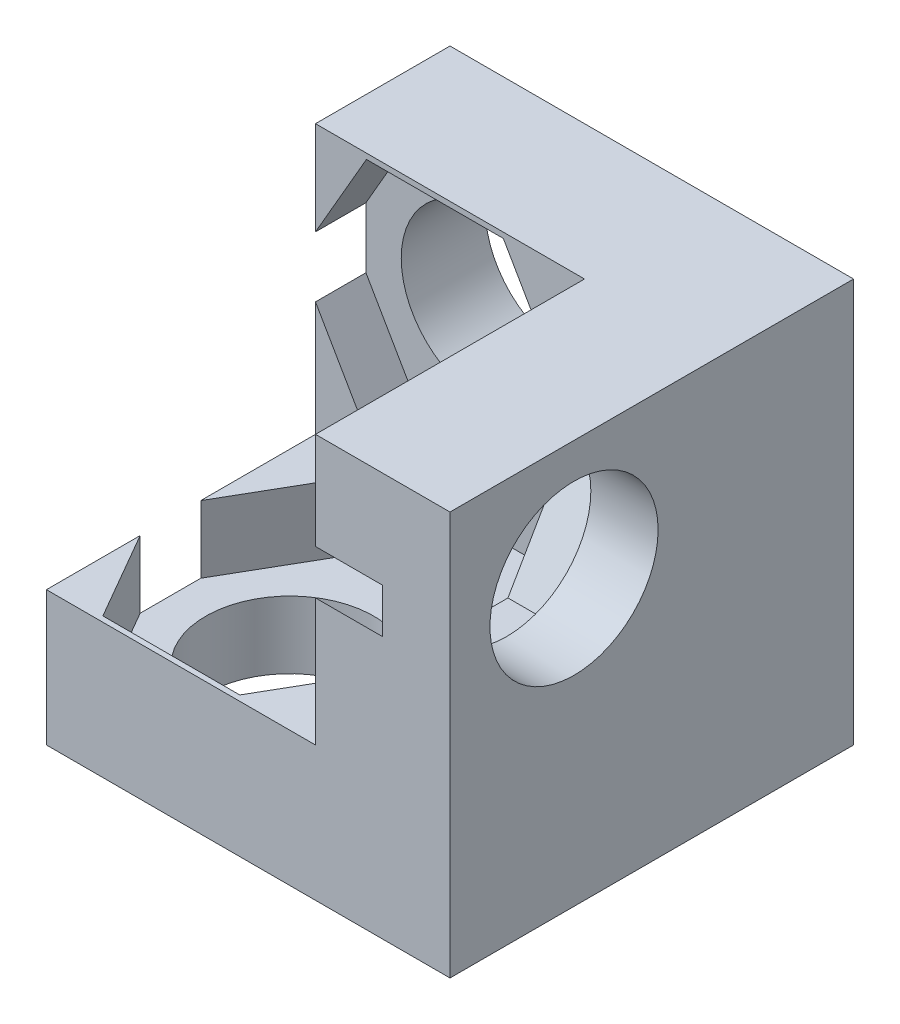
ISO-10303-21;
HEADER;
FILE_DESCRIPTION(('STEP AP214'),'2;1');
FILE_NAME('part.step','',(''),(''),'','','');
FILE_SCHEMA(('AUTOMOTIVE_DESIGN { 1 0 10303 214 1 1 1 1 }'));
ENDSEC;
DATA;
#1=APPLICATION_CONTEXT('core data for automotive mechanical design processes');
#2=APPLICATION_PROTOCOL_DEFINITION('international standard','automotive_design',2000,#1);
#3=PRODUCT_CONTEXT('',#1,'mechanical');
#4=PRODUCT('Part','Part','',(#3));
#5=PRODUCT_RELATED_PRODUCT_CATEGORY('part','',(#4));
#6=PRODUCT_DEFINITION_FORMATION('','',#4);
#7=PRODUCT_DEFINITION_CONTEXT('part definition',#1,'design');
#8=PRODUCT_DEFINITION('design','',#6,#7);
#9=PRODUCT_DEFINITION_SHAPE('','',#8);
#10=(LENGTH_UNIT() NAMED_UNIT(*) SI_UNIT(.MILLI.,.METRE.));
#11=(NAMED_UNIT(*) PLANE_ANGLE_UNIT() SI_UNIT($,.RADIAN.));
#12=(NAMED_UNIT(*) SI_UNIT($,.STERADIAN.) SOLID_ANGLE_UNIT());
#13=UNCERTAINTY_MEASURE_WITH_UNIT(LENGTH_MEASURE(1.E-05),#10,'distance_accuracy_value','');
#14=(GEOMETRIC_REPRESENTATION_CONTEXT(3) GLOBAL_UNCERTAINTY_ASSIGNED_CONTEXT((#13)) GLOBAL_UNIT_ASSIGNED_CONTEXT((#10,
#11,#12)) REPRESENTATION_CONTEXT('',''));
#15=CARTESIAN_POINT('',(0.,0.,0.));
#16=DIRECTION('',(0.,0.,1.));
#17=DIRECTION('',(1.,0.,0.));
#18=AXIS2_PLACEMENT_3D('',#15,#16,#17);
#19=CARTESIAN_POINT('',(-6.,2.44974747,8.31217259));
#20=DIRECTION('',(1.,0.,0.));
#21=DIRECTION('',(0.,0.,-1.));
#22=AXIS2_PLACEMENT_3D('',#19,#20,#21);
#23=CYLINDRICAL_SURFACE('',#22,2.5);
#24=CARTESIAN_POINT('',(6.,2.44974747,8.31217259));
#25=DIRECTION('',(1.,0.,0.));
#26=DIRECTION('',(0.,0.,-1.));
#27=AXIS2_PLACEMENT_3D('',#24,#25,#26);
#28=CIRCLE('',#27,2.5);
#29=CARTESIAN_POINT('',(6.,2.44974747,5.81217259));
#30=VERTEX_POINT('',#29);
#31=EDGE_CURVE('E421',#30,#30,#28,.T.);
#32=ORIENTED_EDGE('',*,*,#31,.T.);
#33=EDGE_LOOP('',(#32));
#34=FACE_BOUND('',#33,.T.);
#35=CARTESIAN_POINT('',(4.,2.44974747,8.31217259));
#36=DIRECTION('',(-1.,0.,0.));
#37=DIRECTION('',(0.,0.,1.));
#38=AXIS2_PLACEMENT_3D('',#35,#36,#37);
#39=CIRCLE('',#38,2.5);
#40=CARTESIAN_POINT('',(4.,2.44974747,10.81217259));
#41=VERTEX_POINT('',#40);
#42=EDGE_CURVE('E291',#41,#41,#39,.F.);
#43=ORIENTED_EDGE('',*,*,#42,.F.);
#44=EDGE_LOOP('',(#43));
#45=FACE_BOUND('',#44,.T.);
#46=ADVANCED_FACE('F46',(#34,#45),#23,.F.);
#47=CARTESIAN_POINT('',(-2.44974747,-6.,8.31217259));
#48=DIRECTION('',(0.,1.,0.));
#49=DIRECTION('',(0.,0.,1.));
#50=AXIS2_PLACEMENT_3D('',#47,#48,#49);
#51=CYLINDRICAL_SURFACE('',#50,2.5);
#52=CARTESIAN_POINT('',(-2.44974747,-6.,8.31217259));
#53=DIRECTION('',(0.,1.,0.));
#54=DIRECTION('',(0.,0.,1.));
#55=AXIS2_PLACEMENT_3D('',#52,#53,#54);
#56=CIRCLE('',#55,2.5);
#57=CARTESIAN_POINT('',(-2.44974747,-6.,10.81217259));
#58=VERTEX_POINT('',#57);
#59=EDGE_CURVE('E430',#58,#58,#56,.T.);
#60=ORIENTED_EDGE('',*,*,#59,.F.);
#61=EDGE_LOOP('',(#60));
#62=FACE_BOUND('',#61,.T.);
#63=CARTESIAN_POINT('',(-2.44974747,-4.,8.31217259));
#64=DIRECTION('',(0.,1.,0.));
#65=DIRECTION('',(0.,0.,1.));
#66=AXIS2_PLACEMENT_3D('',#63,#64,#65);
#67=CIRCLE('',#66,2.5);
#68=CARTESIAN_POINT('',(-2.44974747,-4.,10.81217259));
#69=VERTEX_POINT('',#68);
#70=EDGE_CURVE('E352',#69,#69,#67,.F.);
#71=ORIENTED_EDGE('',*,*,#70,.F.);
#72=EDGE_LOOP('',(#71));
#73=FACE_BOUND('',#72,.T.);
#74=ADVANCED_FACE('F626',(#62,#73),#51,.F.);
#75=CARTESIAN_POINT('',(0.,6.,12.));
#76=DIRECTION('',(0.,1.,0.));
#77=DIRECTION('',(0.,0.,1.));
#78=AXIS2_PLACEMENT_3D('',#75,#76,#77);
#79=PLANE('',#78);
#80=DIRECTION('',(1.,0.,0.));
#81=VECTOR('',#80,1.);
#82=CARTESIAN_POINT('',(0.,6.,4.));
#83=LINE('',#82,#81);
#84=CARTESIAN_POINT('',(-6.,6.,4.));
#85=VERTEX_POINT('',#84);
#86=CARTESIAN_POINT('',(2.,6.,4.));
#87=VERTEX_POINT('',#86);
#88=EDGE_CURVE('E440',#85,#87,#83,.T.);
#89=ORIENTED_EDGE('',*,*,#88,.T.);
#90=DIRECTION('',(0.,0.,1.));
#91=VECTOR('',#90,1.);
#92=CARTESIAN_POINT('',(2.,6.,0.));
#93=LINE('',#92,#91);
#94=CARTESIAN_POINT('',(2.,6.,12.));
#95=VERTEX_POINT('',#94);
#96=EDGE_CURVE('E431',#87,#95,#93,.T.);
#97=ORIENTED_EDGE('',*,*,#96,.T.);
#98=DIRECTION('',(1.,0.,0.));
#99=VECTOR('',#98,1.);
#100=CARTESIAN_POINT('',(0.,6.,12.));
#101=LINE('',#100,#99);
#102=CARTESIAN_POINT('',(6.,6.,12.));
#103=VERTEX_POINT('',#102);
#104=EDGE_CURVE('E480',#95,#103,#101,.T.);
#105=ORIENTED_EDGE('',*,*,#104,.T.);
#106=DIRECTION('',(0.,0.,-1.));
#107=VECTOR('',#106,1.);
#108=CARTESIAN_POINT('',(6.,6.,12.));
#109=LINE('',#108,#107);
#110=CARTESIAN_POINT('',(6.,6.,0.));
#111=VERTEX_POINT('',#110);
#112=EDGE_CURVE('E503',#103,#111,#109,.T.);
#113=ORIENTED_EDGE('',*,*,#112,.T.);
#114=DIRECTION('',(1.,0.,0.));
#115=VECTOR('',#114,1.);
#116=CARTESIAN_POINT('',(0.,6.,0.));
#117=LINE('',#116,#115);
#118=CARTESIAN_POINT('',(-6.,6.,0.));
#119=VERTEX_POINT('',#118);
#120=EDGE_CURVE('E493',#119,#111,#117,.T.);
#121=ORIENTED_EDGE('',*,*,#120,.F.);
#122=DIRECTION('',(0.,0.,-1.));
#123=VECTOR('',#122,1.);
#124=CARTESIAN_POINT('',(-6.,6.,12.));
#125=LINE('',#124,#123);
#126=EDGE_CURVE('E499',#85,#119,#125,.T.);
#127=ORIENTED_EDGE('',*,*,#126,.F.);
#128=EDGE_LOOP('',(#89,#97,#105,#113,#121,#127));
#129=FACE_BOUND('',#128,.T.);
#130=ADVANCED_FACE('F585',(#129),#79,.T.);
#131=CARTESIAN_POINT('',(0.,-6.,12.));
#132=DIRECTION('',(0.,1.,0.));
#133=DIRECTION('',(0.,0.,1.));
#134=AXIS2_PLACEMENT_3D('',#131,#132,#133);
#135=PLANE('',#134);
#136=ORIENTED_EDGE('',*,*,#59,.T.);
#137=EDGE_LOOP('',(#136));
#138=FACE_BOUND('',#137,.T.);
#139=DIRECTION('',(1.,0.,0.));
#140=VECTOR('',#139,1.);
#141=CARTESIAN_POINT('',(0.,-6.,0.));
#142=LINE('',#141,#140);
#143=CARTESIAN_POINT('',(-6.,-6.,0.));
#144=VERTEX_POINT('',#143);
#145=CARTESIAN_POINT('',(6.,-6.,0.));
#146=VERTEX_POINT('',#145);
#147=EDGE_CURVE('E457',#144,#146,#142,.T.);
#148=ORIENTED_EDGE('',*,*,#147,.T.);
#149=DIRECTION('',(0.,0.,-1.));
#150=VECTOR('',#149,1.);
#151=CARTESIAN_POINT('',(6.,-6.,12.));
#152=LINE('',#151,#150);
#153=CARTESIAN_POINT('',(6.,-6.,12.));
#154=VERTEX_POINT('',#153);
#155=EDGE_CURVE('E506',#154,#146,#152,.T.);
#156=ORIENTED_EDGE('',*,*,#155,.F.);
#157=DIRECTION('',(1.,0.,0.));
#158=VECTOR('',#157,1.);
#159=CARTESIAN_POINT('',(0.,-6.,12.));
#160=LINE('',#159,#158);
#161=CARTESIAN_POINT('',(-6.,-6.,12.));
#162=VERTEX_POINT('',#161);
#163=EDGE_CURVE('E466',#162,#154,#160,.T.);
#164=ORIENTED_EDGE('',*,*,#163,.F.);
#165=DIRECTION('',(0.,0.,-1.));
#166=VECTOR('',#165,1.);
#167=CARTESIAN_POINT('',(-6.,-6.,12.));
#168=LINE('',#167,#166);
#169=EDGE_CURVE('E485',#162,#144,#168,.T.);
#170=ORIENTED_EDGE('',*,*,#169,.T.);
#171=EDGE_LOOP('',(#148,#156,#164,#170));
#172=FACE_BOUND('',#171,.T.);
#173=ADVANCED_FACE('F48',(#138,#172),#135,.F.);
#174=CARTESIAN_POINT('',(6.,0.,12.));
#175=DIRECTION('',(-1.,0.,0.));
#176=DIRECTION('',(0.,0.,1.));
#177=AXIS2_PLACEMENT_3D('',#174,#175,#176);
#178=PLANE('',#177);
#179=ORIENTED_EDGE('',*,*,#31,.F.);
#180=EDGE_LOOP('',(#179));
#181=FACE_BOUND('',#180,.T.);
#182=DIRECTION('',(0.,1.,0.));
#183=VECTOR('',#182,1.);
#184=CARTESIAN_POINT('',(6.,0.,0.));
#185=LINE('',#184,#183);
#186=EDGE_CURVE('E487',#146,#111,#185,.T.);
#187=ORIENTED_EDGE('',*,*,#186,.T.);
#188=ORIENTED_EDGE('',*,*,#112,.F.);
#189=DIRECTION('',(0.,1.,0.));
#190=VECTOR('',#189,1.);
#191=CARTESIAN_POINT('',(6.,0.,12.));
#192=LINE('',#191,#190);
#193=EDGE_CURVE('E475',#154,#103,#192,.T.);
#194=ORIENTED_EDGE('',*,*,#193,.F.);
#195=ORIENTED_EDGE('',*,*,#155,.T.);
#196=EDGE_LOOP('',(#187,#188,#194,#195));
#197=FACE_BOUND('',#196,.T.);
#198=ADVANCED_FACE('F576',(#181,#197),#178,.F.);
#199=CARTESIAN_POINT('',(-6.,0.,12.));
#200=DIRECTION('',(1.,0.,0.));
#201=DIRECTION('',(0.,0.,-1.));
#202=AXIS2_PLACEMENT_3D('',#199,#200,#201);
#203=PLANE('',#202);
#204=DIRECTION('',(0.,0.,1.));
#205=VECTOR('',#204,1.);
#206=CARTESIAN_POINT('',(-6.,-2.,0.));
#207=LINE('',#206,#205);
#208=CARTESIAN_POINT('',(-6.,-2.,9.21295482834005));
#209=VERTEX_POINT('',#208);
#210=CARTESIAN_POINT('',(-6.,-2.,12.));
#211=VERTEX_POINT('',#210);
#212=EDGE_CURVE('E439',#209,#211,#207,.T.);
#213=ORIENTED_EDGE('',*,*,#212,.F.);
#214=DIRECTION('',(0.,-1.,0.));
#215=VECTOR('',#214,1.);
#216=CARTESIAN_POINT('',(-6.,0.,9.21295482834005));
#217=LINE('',#216,#215);
#218=CARTESIAN_POINT('',(-6.,-4.,9.21295482834005));
#219=VERTEX_POINT('',#218);
#220=EDGE_CURVE('E538',#209,#219,#217,.T.);
#221=ORIENTED_EDGE('',*,*,#220,.T.);
#222=DIRECTION('',(0.,0.,1.));
#223=VECTOR('',#222,1.);
#224=CARTESIAN_POINT('',(-6.,-4.,12.));
#225=LINE('',#224,#223);
#226=CARTESIAN_POINT('',(-6.,-4.,7.41139035165995));
#227=VERTEX_POINT('',#226);
#228=EDGE_CURVE('E364',#227,#219,#225,.T.);
#229=ORIENTED_EDGE('',*,*,#228,.F.);
#230=DIRECTION('',(0.,1.,0.));
#231=VECTOR('',#230,1.);
#232=CARTESIAN_POINT('',(-6.,0.,7.41139035165995));
#233=LINE('',#232,#231);
#234=CARTESIAN_POINT('',(-6.,-2.,7.41139035165995));
#235=VERTEX_POINT('',#234);
#236=EDGE_CURVE('E535',#227,#235,#233,.T.);
#237=ORIENTED_EDGE('',*,*,#236,.T.);
#238=CARTESIAN_POINT('',(-6.,-2.,4.));
#239=VERTEX_POINT('',#238);
#240=EDGE_CURVE('E441',#239,#235,#207,.T.);
#241=ORIENTED_EDGE('',*,*,#240,.F.);
#242=DIRECTION('',(0.,1.,0.));
#243=VECTOR('',#242,1.);
#244=CARTESIAN_POINT('',(-6.,-2.,4.));
#245=LINE('',#244,#243);
#246=CARTESIAN_POINT('',(-6.,1.41139035165995,4.));
#247=VERTEX_POINT('',#246);
#248=EDGE_CURVE('E462',#239,#247,#245,.T.);
#249=ORIENTED_EDGE('',*,*,#248,.T.);
#250=DIRECTION('',(0.,0.,-1.));
#251=VECTOR('',#250,1.);
#252=CARTESIAN_POINT('',(-6.,1.41139035165995,12.));
#253=LINE('',#252,#251);
#254=CARTESIAN_POINT('',(-6.,1.41139035165995,2.5));
#255=VERTEX_POINT('',#254);
#256=EDGE_CURVE('E414',#247,#255,#253,.T.);
#257=ORIENTED_EDGE('',*,*,#256,.T.);
#258=DIRECTION('',(0.,1.,0.));
#259=VECTOR('',#258,1.);
#260=CARTESIAN_POINT('',(-6.,0.,2.5));
#261=LINE('',#260,#259);
#262=CARTESIAN_POINT('',(-6.,3.21295482834005,2.5));
#263=VERTEX_POINT('',#262);
#264=EDGE_CURVE('E410',#255,#263,#261,.T.);
#265=ORIENTED_EDGE('',*,*,#264,.T.);
#266=DIRECTION('',(0.,0.,1.));
#267=VECTOR('',#266,1.);
#268=CARTESIAN_POINT('',(-6.,3.21295482834005,12.));
#269=LINE('',#268,#267);
#270=CARTESIAN_POINT('',(-6.,3.21295482834005,4.));
#271=VERTEX_POINT('',#270);
#272=EDGE_CURVE('E411',#263,#271,#269,.T.);
#273=ORIENTED_EDGE('',*,*,#272,.T.);
#274=EDGE_CURVE('E463',#271,#85,#245,.T.);
#275=ORIENTED_EDGE('',*,*,#274,.T.);
#276=ORIENTED_EDGE('',*,*,#126,.T.);
#277=DIRECTION('',(0.,-1.,0.));
#278=VECTOR('',#277,1.);
#279=CARTESIAN_POINT('',(-6.,0.,0.));
#280=LINE('',#279,#278);
#281=EDGE_CURVE('E472',#119,#144,#280,.T.);
#282=ORIENTED_EDGE('',*,*,#281,.T.);
#283=ORIENTED_EDGE('',*,*,#169,.F.);
#284=DIRECTION('',(0.,-1.,0.));
#285=VECTOR('',#284,1.);
#286=CARTESIAN_POINT('',(-6.,0.,12.));
#287=LINE('',#286,#285);
#288=EDGE_CURVE('E479',#211,#162,#287,.T.);
#289=ORIENTED_EDGE('',*,*,#288,.F.);
#290=EDGE_LOOP('',(#213,#221,#229,#237,#241,#249,#257,#265,#273,#275,#276,#282,#283,#289));
#291=FACE_BOUND('',#290,.T.);
#292=ADVANCED_FACE('F571',(#291),#203,.F.);
#293=CARTESIAN_POINT('',(0.,0.,12.));
#294=DIRECTION('',(0.,0.,1.));
#295=DIRECTION('',(1.,0.,0.));
#296=AXIS2_PLACEMENT_3D('',#293,#294,#295);
#297=PLANE('',#296);
#298=DIRECTION('',(1.,0.,0.));
#299=VECTOR('',#298,1.);
#300=CARTESIAN_POINT('',(0.,1.78725191366514,12.));
#301=LINE('',#300,#299);
#302=CARTESIAN_POINT('',(2.,1.78725191366514,12.));
#303=VERTEX_POINT('',#302);
#304=CARTESIAN_POINT('',(4.,1.78725191366514,12.));
#305=VERTEX_POINT('',#304);
#306=EDGE_CURVE('E11',#303,#305,#301,.T.);
#307=ORIENTED_EDGE('',*,*,#306,.F.);
#308=DIRECTION('',(0.,1.,0.));
#309=VECTOR('',#308,1.);
#310=CARTESIAN_POINT('',(2.,-2.,12.));
#311=LINE('',#310,#309);
#312=CARTESIAN_POINT('',(2.,-2.,12.));
#313=VERTEX_POINT('',#312);
#314=EDGE_CURVE('E454',#313,#303,#311,.T.);
#315=ORIENTED_EDGE('',*,*,#314,.F.);
#316=DIRECTION('',(1.,0.,0.));
#317=VECTOR('',#316,1.);
#318=CARTESIAN_POINT('',(0.,-2.,12.));
#319=LINE('',#318,#317);
#320=EDGE_CURVE('E444',#211,#313,#319,.T.);
#321=ORIENTED_EDGE('',*,*,#320,.F.);
#322=ORIENTED_EDGE('',*,*,#288,.T.);
#323=ORIENTED_EDGE('',*,*,#163,.T.);
#324=ORIENTED_EDGE('',*,*,#193,.T.);
#325=ORIENTED_EDGE('',*,*,#104,.F.);
#326=CARTESIAN_POINT('',(2.,3.11224302633486,12.));
#327=VERTEX_POINT('',#326);
#328=EDGE_CURVE('E459',#327,#95,#311,.T.);
#329=ORIENTED_EDGE('',*,*,#328,.F.);
#330=DIRECTION('',(-1.,0.,0.));
#331=VECTOR('',#330,1.);
#332=CARTESIAN_POINT('',(0.,3.11224302633486,12.));
#333=LINE('',#332,#331);
#334=CARTESIAN_POINT('',(4.,3.11224302633486,12.));
#335=VERTEX_POINT('',#334);
#336=EDGE_CURVE('E54',#335,#327,#333,.T.);
#337=ORIENTED_EDGE('',*,*,#336,.F.);
#338=DIRECTION('',(0.,-1.,0.));
#339=VECTOR('',#338,1.);
#340=CARTESIAN_POINT('',(4.,0.,12.));
#341=LINE('',#340,#339);
#342=EDGE_CURVE('E239',#335,#305,#341,.T.);
#343=ORIENTED_EDGE('',*,*,#342,.T.);
#344=EDGE_LOOP('',(#307,#315,#321,#322,#323,#324,#325,#329,#337,#343));
#345=FACE_BOUND('',#344,.T.);
#346=ADVANCED_FACE('F554',(#345),#297,.T.);
#347=CARTESIAN_POINT('',(0.,0.,0.));
#348=DIRECTION('',(0.,0.,1.));
#349=DIRECTION('',(1.,0.,0.));
#350=AXIS2_PLACEMENT_3D('',#347,#348,#349);
#351=PLANE('',#350);
#352=CARTESIAN_POINT('',(-2.44974747,2.31217259,0.));
#353=DIRECTION('',(0.,0.,-1.));
#354=DIRECTION('',(-1.,0.,0.));
#355=AXIS2_PLACEMENT_3D('',#352,#353,#354);
#356=CIRCLE('',#355,2.5);
#357=CARTESIAN_POINT('',(-4.94974747,2.31217259,0.));
#358=VERTEX_POINT('',#357);
#359=EDGE_CURVE('E416',#358,#358,#356,.T.);
#360=ORIENTED_EDGE('',*,*,#359,.F.);
#361=EDGE_LOOP('',(#360));
#362=FACE_BOUND('',#361,.T.);
#363=ORIENTED_EDGE('',*,*,#147,.F.);
#364=ORIENTED_EDGE('',*,*,#281,.F.);
#365=ORIENTED_EDGE('',*,*,#120,.T.);
#366=ORIENTED_EDGE('',*,*,#186,.F.);
#367=EDGE_LOOP('',(#363,#364,#365,#366));
#368=FACE_BOUND('',#367,.T.);
#369=ADVANCED_FACE('F650',(#362,#368),#351,.F.);
#370=CARTESIAN_POINT('',(2.,-2.,0.));
#371=DIRECTION('',(-1.,0.,0.));
#372=DIRECTION('',(0.,0.,1.));
#373=AXIS2_PLACEMENT_3D('',#370,#371,#372);
#374=PLANE('',#373);
#375=DIRECTION('',(0.,0.866025403784439,0.5));
#376=VECTOR('',#375,1.);
#377=CARTESIAN_POINT('',(2.,-1.07525253,10.3473322888934));
#378=LINE('',#377,#376);
#379=CARTESIAN_POINT('',(2.,-1.07525253,10.3473322888934));
#380=VERTEX_POINT('',#379);
#381=EDGE_CURVE('E268',#380,#303,#378,.T.);
#382=ORIENTED_EDGE('',*,*,#381,.F.);
#383=DIRECTION('',(0.,0.,1.));
#384=VECTOR('',#383,1.);
#385=CARTESIAN_POINT('',(2.,-1.07525253,6.27701289110657));
#386=LINE('',#385,#384);
#387=CARTESIAN_POINT('',(2.,-1.07525253,6.27701289110657));
#388=VERTEX_POINT('',#387);
#389=EDGE_CURVE('E287',#388,#380,#386,.T.);
#390=ORIENTED_EDGE('',*,*,#389,.F.);
#391=DIRECTION('',(0.,-0.866025403784439,0.5));
#392=VECTOR('',#391,1.);
#393=CARTESIAN_POINT('',(2.,2.44974747,4.24185319221314));
#394=LINE('',#393,#392);
#395=CARTESIAN_POINT('',(2.,2.44974747,4.24185319221314));
#396=VERTEX_POINT('',#395);
#397=EDGE_CURVE('E285',#396,#388,#394,.T.);
#398=ORIENTED_EDGE('',*,*,#397,.F.);
#399=DIRECTION('',(0.,-0.866025403784439,-0.5));
#400=VECTOR('',#399,1.);
#401=CARTESIAN_POINT('',(2.,5.97474747,6.27701289110657));
#402=LINE('',#401,#400);
#403=CARTESIAN_POINT('',(2.,5.97474747,6.27701289110657));
#404=VERTEX_POINT('',#403);
#405=EDGE_CURVE('E277',#404,#396,#402,.T.);
#406=ORIENTED_EDGE('',*,*,#405,.F.);
#407=DIRECTION('',(0.,0.,-1.));
#408=VECTOR('',#407,1.);
#409=CARTESIAN_POINT('',(2.,5.97474747,10.3473322888934));
#410=LINE('',#409,#408);
#411=CARTESIAN_POINT('',(2.,5.97474747,10.3473322888934));
#412=VERTEX_POINT('',#411);
#413=EDGE_CURVE('E273',#412,#404,#410,.T.);
#414=ORIENTED_EDGE('',*,*,#413,.F.);
#415=DIRECTION('',(0.,0.866025403784439,-0.5));
#416=VECTOR('',#415,1.);
#417=CARTESIAN_POINT('',(2.,2.44974747,12.3824919877869));
#418=LINE('',#417,#416);
#419=EDGE_CURVE('E247',#327,#412,#418,.T.);
#420=ORIENTED_EDGE('',*,*,#419,.F.);
#421=ORIENTED_EDGE('',*,*,#328,.T.);
#422=ORIENTED_EDGE('',*,*,#96,.F.);
#423=DIRECTION('',(0.,1.,0.));
#424=VECTOR('',#423,1.);
#425=CARTESIAN_POINT('',(2.,-2.,4.));
#426=LINE('',#425,#424);
#427=CARTESIAN_POINT('',(2.,-2.,4.));
#428=VERTEX_POINT('',#427);
#429=EDGE_CURVE('E449',#428,#87,#426,.T.);
#430=ORIENTED_EDGE('',*,*,#429,.F.);
#431=DIRECTION('',(0.,0.,1.));
#432=VECTOR('',#431,1.);
#433=CARTESIAN_POINT('',(2.,-2.,0.));
#434=LINE('',#433,#432);
#435=EDGE_CURVE('E435',#428,#313,#434,.T.);
#436=ORIENTED_EDGE('',*,*,#435,.T.);
#437=ORIENTED_EDGE('',*,*,#314,.T.);
#438=EDGE_LOOP('',(#382,#390,#398,#406,#414,#420,#421,#422,#430,#436,#437));
#439=FACE_BOUND('',#438,.T.);
#440=ADVANCED_FACE('F548',(#439),#374,.T.);
#441=CARTESIAN_POINT('',(0.,-2.,4.));
#442=DIRECTION('',(0.,0.,1.));
#443=DIRECTION('',(1.,0.,0.));
#444=AXIS2_PLACEMENT_3D('',#441,#442,#443);
#445=PLANE('',#444);
#446=DIRECTION('',(0.5,-0.866025403784439,0.));
#447=VECTOR('',#446,1.);
#448=CARTESIAN_POINT('',(-3.02282464661868,-3.74522862343833,4.));
#449=LINE('',#448,#447);
#450=CARTESIAN_POINT('',(-4.48490716889343,-1.21282741,4.));
#451=VERTEX_POINT('',#450);
#452=EDGE_CURVE('E526',#247,#451,#449,.T.);
#453=ORIENTED_EDGE('',*,*,#452,.F.);
#454=ORIENTED_EDGE('',*,*,#248,.F.);
#455=DIRECTION('',(1.,0.,0.));
#456=VECTOR('',#455,1.);
#457=CARTESIAN_POINT('',(0.,-2.,4.));
#458=LINE('',#457,#456);
#459=EDGE_CURVE('E436',#239,#428,#458,.T.);
#460=ORIENTED_EDGE('',*,*,#459,.T.);
#461=ORIENTED_EDGE('',*,*,#429,.T.);
#462=ORIENTED_EDGE('',*,*,#88,.F.);
#463=ORIENTED_EDGE('',*,*,#274,.F.);
#464=DIRECTION('',(-0.5,-0.866025403784439,0.));
#465=VECTOR('',#464,1.);
#466=CARTESIAN_POINT('',(-6.75727565506162,1.90131491843833,4.));
#467=LINE('',#466,#465);
#468=CARTESIAN_POINT('',(-4.48490716889343,5.83717259,4.));
#469=VERTEX_POINT('',#468);
#470=EDGE_CURVE('E509',#469,#271,#467,.T.);
#471=ORIENTED_EDGE('',*,*,#470,.F.);
#472=DIRECTION('',(-1.,0.,0.));
#473=VECTOR('',#472,1.);
#474=CARTESIAN_POINT('',(0.,5.83717259,4.));
#475=LINE('',#474,#473);
#476=CARTESIAN_POINT('',(-0.414587771106569,5.83717259,4.));
#477=VERTEX_POINT('',#476);
#478=EDGE_CURVE('E516',#477,#469,#475,.T.);
#479=ORIENTED_EDGE('',*,*,#478,.F.);
#480=DIRECTION('',(-0.5,0.866025403784439,0.));
#481=VECTOR('',#480,1.);
#482=CARTESIAN_POINT('',(3.08265445006162,-0.220228623438327,4.));
#483=LINE('',#482,#481);
#484=CARTESIAN_POINT('',(1.62057192778686,2.31217259,4.));
#485=VERTEX_POINT('',#484);
#486=EDGE_CURVE('E519',#485,#477,#483,.T.);
#487=ORIENTED_EDGE('',*,*,#486,.F.);
#488=DIRECTION('',(0.5,0.866025403784439,0.));
#489=VECTOR('',#488,1.);
#490=CARTESIAN_POINT('',(-0.651796558381322,-1.62368508156167,4.));
#491=LINE('',#490,#489);
#492=CARTESIAN_POINT('',(-0.414587771106567,-1.21282741,4.));
#493=VERTEX_POINT('',#492);
#494=EDGE_CURVE('E523',#493,#485,#491,.T.);
#495=ORIENTED_EDGE('',*,*,#494,.F.);
#496=DIRECTION('',(1.,0.,0.));
#497=VECTOR('',#496,1.);
#498=CARTESIAN_POINT('',(0.,-1.21282741,4.));
#499=LINE('',#498,#497);
#500=EDGE_CURVE('E527',#451,#493,#499,.T.);
#501=ORIENTED_EDGE('',*,*,#500,.F.);
#502=EDGE_LOOP('',(#453,#454,#460,#461,#462,#463,#471,#479,#487,#495,#501));
#503=FACE_BOUND('',#502,.T.);
#504=ADVANCED_FACE('F645',(#503),#445,.T.);
#505=CARTESIAN_POINT('',(0.,-2.,0.));
#506=DIRECTION('',(0.,1.,0.));
#507=DIRECTION('',(0.,0.,1.));
#508=AXIS2_PLACEMENT_3D('',#505,#506,#507);
#509=PLANE('',#508);
#510=DIRECTION('',(-0.5,0.,0.866025403784439));
#511=VECTOR('',#510,1.);
#512=CARTESIAN_POINT('',(-4.48490716889343,-2.,4.78717259));
#513=LINE('',#512,#511);
#514=CARTESIAN_POINT('',(-4.48490716889343,-2.,4.78717259));
#515=VERTEX_POINT('',#514);
#516=EDGE_CURVE('E339',#515,#235,#513,.T.);
#517=ORIENTED_EDGE('',*,*,#516,.F.);
#518=DIRECTION('',(-1.,0.,0.));
#519=VECTOR('',#518,1.);
#520=CARTESIAN_POINT('',(-0.414587771106569,-2.,4.78717259));
#521=LINE('',#520,#519);
#522=CARTESIAN_POINT('',(-0.414587771106569,-2.,4.78717259));
#523=VERTEX_POINT('',#522);
#524=EDGE_CURVE('E333',#523,#515,#521,.T.);
#525=ORIENTED_EDGE('',*,*,#524,.F.);
#526=DIRECTION('',(-0.5,0.,-0.866025403784439));
#527=VECTOR('',#526,1.);
#528=CARTESIAN_POINT('',(1.62057192778686,-2.,8.31217259));
#529=LINE('',#528,#527);
#530=CARTESIAN_POINT('',(1.62057192778686,-2.,8.31217259));
#531=VERTEX_POINT('',#530);
#532=EDGE_CURVE('E332',#531,#523,#529,.T.);
#533=ORIENTED_EDGE('',*,*,#532,.F.);
#534=DIRECTION('',(0.5,0.,-0.866025403784439));
#535=VECTOR('',#534,1.);
#536=CARTESIAN_POINT('',(-0.414587771106567,-2.,11.83717259));
#537=LINE('',#536,#535);
#538=CARTESIAN_POINT('',(-0.414587771106567,-2.,11.83717259));
#539=VERTEX_POINT('',#538);
#540=EDGE_CURVE('E69',#539,#531,#537,.T.);
#541=ORIENTED_EDGE('',*,*,#540,.F.);
#542=DIRECTION('',(1.,0.,0.));
#543=VECTOR('',#542,1.);
#544=CARTESIAN_POINT('',(-4.48490716889343,-2.,11.83717259));
#545=LINE('',#544,#543);
#546=CARTESIAN_POINT('',(-4.48490716889343,-2.,11.83717259));
#547=VERTEX_POINT('',#546);
#548=EDGE_CURVE('E307',#547,#539,#545,.T.);
#549=ORIENTED_EDGE('',*,*,#548,.F.);
#550=DIRECTION('',(0.5,0.,0.866025403784439));
#551=VECTOR('',#550,1.);
#552=CARTESIAN_POINT('',(-6.52006686778686,-2.,8.31217259));
#553=LINE('',#552,#551);
#554=EDGE_CURVE('E345',#209,#547,#553,.T.);
#555=ORIENTED_EDGE('',*,*,#554,.F.);
#556=ORIENTED_EDGE('',*,*,#212,.T.);
#557=ORIENTED_EDGE('',*,*,#320,.T.);
#558=ORIENTED_EDGE('',*,*,#435,.F.);
#559=ORIENTED_EDGE('',*,*,#459,.F.);
#560=ORIENTED_EDGE('',*,*,#240,.T.);
#561=EDGE_LOOP('',(#517,#525,#533,#541,#549,#555,#556,#557,#558,#559,#560));
#562=FACE_BOUND('',#561,.T.);
#563=ADVANCED_FACE('F562',(#562),#509,.T.);
#564=CARTESIAN_POINT('',(-2.44974747,2.31217259,12.));
#565=DIRECTION('',(0.,0.,-1.));
#566=DIRECTION('',(-1.,0.,0.));
#567=AXIS2_PLACEMENT_3D('',#564,#565,#566);
#568=CYLINDRICAL_SURFACE('',#567,2.5);
#569=CARTESIAN_POINT('',(-2.44974747,2.31217259,2.5));
#570=DIRECTION('',(0.,0.,-1.));
#571=DIRECTION('',(-1.,0.,0.));
#572=AXIS2_PLACEMENT_3D('',#569,#570,#571);
#573=CIRCLE('',#572,2.5);
#574=CARTESIAN_POINT('',(-4.94974747,2.31217259,2.5));
#575=VERTEX_POINT('',#574);
#576=EDGE_CURVE('E394',#575,#575,#573,.F.);
#577=ORIENTED_EDGE('',*,*,#576,.T.);
#578=EDGE_LOOP('',(#577));
#579=FACE_BOUND('',#578,.T.);
#580=ORIENTED_EDGE('',*,*,#359,.T.);
#581=EDGE_LOOP('',(#580));
#582=FACE_BOUND('',#581,.T.);
#583=ADVANCED_FACE('F637',(#579,#582),#568,.F.);
#584=CARTESIAN_POINT('',(-4.48490716889343,-1.21282741,12.5));
#585=DIRECTION('',(-0.866025403784439,-0.5,0.));
#586=DIRECTION('',(0.5,-0.866025403784439,0.));
#587=AXIS2_PLACEMENT_3D('',#584,#585,#586);
#588=PLANE('',#587);
#589=ORIENTED_EDGE('',*,*,#452,.T.);
#590=DIRECTION('',(0.,0.,-1.));
#591=VECTOR('',#590,1.);
#592=CARTESIAN_POINT('',(-4.48490716889343,-1.21282741,12.5));
#593=LINE('',#592,#591);
#594=CARTESIAN_POINT('',(-4.48490716889343,-1.21282741,2.5));
#595=VERTEX_POINT('',#594);
#596=EDGE_CURVE('E395',#451,#595,#593,.T.);
#597=ORIENTED_EDGE('',*,*,#596,.T.);
#598=DIRECTION('',(-0.5,0.866025403784439,0.));
#599=VECTOR('',#598,1.);
#600=CARTESIAN_POINT('',(-4.48490716889343,-1.21282741,2.5));
#601=LINE('',#600,#599);
#602=EDGE_CURVE('E370',#595,#255,#601,.T.);
#603=ORIENTED_EDGE('',*,*,#602,.T.);
#604=ORIENTED_EDGE('',*,*,#256,.F.);
#605=EDGE_LOOP('',(#589,#597,#603,#604));
#606=FACE_BOUND('',#605,.T.);
#607=ADVANCED_FACE('F702',(#606),#588,.F.);
#608=CARTESIAN_POINT('',(-6.52006686778686,2.31217259,12.5));
#609=DIRECTION('',(-0.866025403784439,0.5,0.));
#610=DIRECTION('',(-0.5,-0.866025403784439,0.));
#611=AXIS2_PLACEMENT_3D('',#608,#609,#610);
#612=PLANE('',#611);
#613=DIRECTION('',(0.5,0.866025403784439,0.));
#614=VECTOR('',#613,1.);
#615=CARTESIAN_POINT('',(-6.52006686778686,2.31217259,2.5));
#616=LINE('',#615,#614);
#617=CARTESIAN_POINT('',(-4.48490716889343,5.83717259,2.5));
#618=VERTEX_POINT('',#617);
#619=EDGE_CURVE('E371',#263,#618,#616,.T.);
#620=ORIENTED_EDGE('',*,*,#619,.T.);
#621=DIRECTION('',(0.,0.,-1.));
#622=VECTOR('',#621,1.);
#623=CARTESIAN_POINT('',(-4.48490716889343,5.83717259,12.5));
#624=LINE('',#623,#622);
#625=EDGE_CURVE('E391',#469,#618,#624,.T.);
#626=ORIENTED_EDGE('',*,*,#625,.F.);
#627=ORIENTED_EDGE('',*,*,#470,.T.);
#628=ORIENTED_EDGE('',*,*,#272,.F.);
#629=EDGE_LOOP('',(#620,#626,#627,#628));
#630=FACE_BOUND('',#629,.T.);
#631=ADVANCED_FACE('F687',(#630),#612,.F.);
#632=CARTESIAN_POINT('',(0.,0.,2.5));
#633=DIRECTION('',(0.,0.,-1.));
#634=DIRECTION('',(-1.,0.,0.));
#635=AXIS2_PLACEMENT_3D('',#632,#633,#634);
#636=PLANE('',#635);
#637=ORIENTED_EDGE('',*,*,#576,.F.);
#638=EDGE_LOOP('',(#637));
#639=FACE_BOUND('',#638,.T.);
#640=ORIENTED_EDGE('',*,*,#602,.F.);
#641=DIRECTION('',(-1.,0.,0.));
#642=VECTOR('',#641,1.);
#643=CARTESIAN_POINT('',(-0.414587771106567,-1.21282741,2.5));
#644=LINE('',#643,#642);
#645=CARTESIAN_POINT('',(-0.414587771106567,-1.21282741,2.5));
#646=VERTEX_POINT('',#645);
#647=EDGE_CURVE('E390',#646,#595,#644,.T.);
#648=ORIENTED_EDGE('',*,*,#647,.F.);
#649=DIRECTION('',(-0.5,-0.866025403784439,0.));
#650=VECTOR('',#649,1.);
#651=CARTESIAN_POINT('',(1.62057192778686,2.31217259,2.5));
#652=LINE('',#651,#650);
#653=CARTESIAN_POINT('',(1.62057192778686,2.31217259,2.5));
#654=VERTEX_POINT('',#653);
#655=EDGE_CURVE('E384',#654,#646,#652,.T.);
#656=ORIENTED_EDGE('',*,*,#655,.F.);
#657=DIRECTION('',(0.5,-0.866025403784439,0.));
#658=VECTOR('',#657,1.);
#659=CARTESIAN_POINT('',(-0.414587771106569,5.83717259,2.5));
#660=LINE('',#659,#658);
#661=CARTESIAN_POINT('',(-0.414587771106569,5.83717259,2.5));
#662=VERTEX_POINT('',#661);
#663=EDGE_CURVE('E378',#662,#654,#660,.T.);
#664=ORIENTED_EDGE('',*,*,#663,.F.);
#665=DIRECTION('',(1.,0.,0.));
#666=VECTOR('',#665,1.);
#667=CARTESIAN_POINT('',(-4.48490716889343,5.83717259,2.5));
#668=LINE('',#667,#666);
#669=EDGE_CURVE('E374',#618,#662,#668,.T.);
#670=ORIENTED_EDGE('',*,*,#669,.F.);
#671=ORIENTED_EDGE('',*,*,#619,.F.);
#672=ORIENTED_EDGE('',*,*,#264,.F.);
#673=EDGE_LOOP('',(#640,#648,#656,#664,#670,#671,#672));
#674=FACE_BOUND('',#673,.T.);
#675=ADVANCED_FACE('F688',(#639,#674),#636,.F.);
#676=CARTESIAN_POINT('',(-0.414587771106567,-1.21282741,12.5));
#677=DIRECTION('',(0.,-1.,0.));
#678=DIRECTION('',(1.,0.,0.));
#679=AXIS2_PLACEMENT_3D('',#676,#677,#678);
#680=PLANE('',#679);
#681=ORIENTED_EDGE('',*,*,#500,.T.);
#682=DIRECTION('',(0.,0.,-1.));
#683=VECTOR('',#682,1.);
#684=CARTESIAN_POINT('',(-0.414587771106567,-1.21282741,12.5));
#685=LINE('',#684,#683);
#686=EDGE_CURVE('E397',#493,#646,#685,.T.);
#687=ORIENTED_EDGE('',*,*,#686,.T.);
#688=ORIENTED_EDGE('',*,*,#647,.T.);
#689=ORIENTED_EDGE('',*,*,#596,.F.);
#690=EDGE_LOOP('',(#681,#687,#688,#689));
#691=FACE_BOUND('',#690,.T.);
#692=ADVANCED_FACE('F689',(#691),#680,.F.);
#693=CARTESIAN_POINT('',(1.62057192778686,2.31217259,12.5));
#694=DIRECTION('',(0.866025403784439,-0.5,0.));
#695=DIRECTION('',(0.5,0.866025403784439,0.));
#696=AXIS2_PLACEMENT_3D('',#693,#694,#695);
#697=PLANE('',#696);
#698=ORIENTED_EDGE('',*,*,#494,.T.);
#699=DIRECTION('',(0.,0.,-1.));
#700=VECTOR('',#699,1.);
#701=CARTESIAN_POINT('',(1.62057192778686,2.31217259,12.5));
#702=LINE('',#701,#700);
#703=EDGE_CURVE('E396',#485,#654,#702,.T.);
#704=ORIENTED_EDGE('',*,*,#703,.T.);
#705=ORIENTED_EDGE('',*,*,#655,.T.);
#706=ORIENTED_EDGE('',*,*,#686,.F.);
#707=EDGE_LOOP('',(#698,#704,#705,#706));
#708=FACE_BOUND('',#707,.T.);
#709=ADVANCED_FACE('F692',(#708),#697,.F.);
#710=CARTESIAN_POINT('',(-0.414587771106569,5.83717259,12.5));
#711=DIRECTION('',(0.866025403784439,0.5,0.));
#712=DIRECTION('',(-0.5,0.866025403784439,0.));
#713=AXIS2_PLACEMENT_3D('',#710,#711,#712);
#714=PLANE('',#713);
#715=ORIENTED_EDGE('',*,*,#486,.T.);
#716=DIRECTION('',(0.,0.,-1.));
#717=VECTOR('',#716,1.);
#718=CARTESIAN_POINT('',(-0.414587771106569,5.83717259,12.5));
#719=LINE('',#718,#717);
#720=EDGE_CURVE('E405',#477,#662,#719,.T.);
#721=ORIENTED_EDGE('',*,*,#720,.T.);
#722=ORIENTED_EDGE('',*,*,#663,.T.);
#723=ORIENTED_EDGE('',*,*,#703,.F.);
#724=EDGE_LOOP('',(#715,#721,#722,#723));
#725=FACE_BOUND('',#724,.T.);
#726=ADVANCED_FACE('F623',(#725),#714,.F.);
#727=CARTESIAN_POINT('',(-4.48490716889343,5.83717259,12.5));
#728=DIRECTION('',(0.,1.,0.));
#729=DIRECTION('',(0.,0.,1.));
#730=AXIS2_PLACEMENT_3D('',#727,#728,#729);
#731=PLANE('',#730);
#732=ORIENTED_EDGE('',*,*,#478,.T.);
#733=ORIENTED_EDGE('',*,*,#625,.T.);
#734=ORIENTED_EDGE('',*,*,#669,.T.);
#735=ORIENTED_EDGE('',*,*,#720,.F.);
#736=EDGE_LOOP('',(#732,#733,#734,#735));
#737=FACE_BOUND('',#736,.T.);
#738=ADVANCED_FACE('F615',(#737),#731,.F.);
#739=CARTESIAN_POINT('',(-6.52006686778686,-4.,8.31217259));
#740=DIRECTION('',(-0.866025403784439,0.,0.5));
#741=DIRECTION('',(0.5,0.,0.866025403784439));
#742=AXIS2_PLACEMENT_3D('',#739,#740,#741);
#743=PLANE('',#742);
#744=ORIENTED_EDGE('',*,*,#554,.T.);
#745=DIRECTION('',(0.,1.,0.));
#746=VECTOR('',#745,1.);
#747=CARTESIAN_POINT('',(-4.48490716889343,-4.,11.83717259));
#748=LINE('',#747,#746);
#749=CARTESIAN_POINT('',(-4.48490716889343,-4.,11.83717259));
#750=VERTEX_POINT('',#749);
#751=EDGE_CURVE('E354',#750,#547,#748,.T.);
#752=ORIENTED_EDGE('',*,*,#751,.F.);
#753=DIRECTION('',(0.5,0.,0.866025403784439));
#754=VECTOR('',#753,1.);
#755=CARTESIAN_POINT('',(-6.52006686778686,-4.,8.31217259));
#756=LINE('',#755,#754);
#757=EDGE_CURVE('E321',#219,#750,#756,.T.);
#758=ORIENTED_EDGE('',*,*,#757,.F.);
#759=ORIENTED_EDGE('',*,*,#220,.F.);
#760=EDGE_LOOP('',(#744,#752,#758,#759));
#761=FACE_BOUND('',#760,.T.);
#762=ADVANCED_FACE('F612',(#761),#743,.F.);
#763=CARTESIAN_POINT('',(-4.48490716889343,-4.,4.78717259));
#764=DIRECTION('',(-0.866025403784439,0.,-0.5));
#765=DIRECTION('',(-0.5,0.,0.866025403784439));
#766=AXIS2_PLACEMENT_3D('',#763,#764,#765);
#767=PLANE('',#766);
#768=DIRECTION('',(-0.5,0.,0.866025403784439));
#769=VECTOR('',#768,1.);
#770=CARTESIAN_POINT('',(-4.48490716889343,-4.,4.78717259));
#771=LINE('',#770,#769);
#772=CARTESIAN_POINT('',(-4.48490716889343,-4.,4.78717259));
#773=VERTEX_POINT('',#772);
#774=EDGE_CURVE('E320',#773,#227,#771,.T.);
#775=ORIENTED_EDGE('',*,*,#774,.F.);
#776=DIRECTION('',(0.,1.,0.));
#777=VECTOR('',#776,1.);
#778=CARTESIAN_POINT('',(-4.48490716889343,-4.,4.78717259));
#779=LINE('',#778,#777);
#780=EDGE_CURVE('E358',#773,#515,#779,.T.);
#781=ORIENTED_EDGE('',*,*,#780,.T.);
#782=ORIENTED_EDGE('',*,*,#516,.T.);
#783=ORIENTED_EDGE('',*,*,#236,.F.);
#784=EDGE_LOOP('',(#775,#781,#782,#783));
#785=FACE_BOUND('',#784,.T.);
#786=ADVANCED_FACE('F594',(#785),#767,.F.);
#787=CARTESIAN_POINT('',(0.,-4.,0.));
#788=DIRECTION('',(0.,1.,0.));
#789=DIRECTION('',(0.,0.,1.));
#790=AXIS2_PLACEMENT_3D('',#787,#788,#789);
#791=PLANE('',#790);
#792=ORIENTED_EDGE('',*,*,#70,.T.);
#793=EDGE_LOOP('',(#792));
#794=FACE_BOUND('',#793,.T.);
#795=ORIENTED_EDGE('',*,*,#228,.T.);
#796=ORIENTED_EDGE('',*,*,#757,.T.);
#797=DIRECTION('',(1.,0.,0.));
#798=VECTOR('',#797,1.);
#799=CARTESIAN_POINT('',(-4.48490716889343,-4.,11.83717259));
#800=LINE('',#799,#798);
#801=CARTESIAN_POINT('',(-0.414587771106567,-4.,11.83717259));
#802=VERTEX_POINT('',#801);
#803=EDGE_CURVE('E323',#750,#802,#800,.T.);
#804=ORIENTED_EDGE('',*,*,#803,.T.);
#805=DIRECTION('',(0.5,0.,-0.866025403784439));
#806=VECTOR('',#805,1.);
#807=CARTESIAN_POINT('',(-0.414587771106567,-4.,11.83717259));
#808=LINE('',#807,#806);
#809=CARTESIAN_POINT('',(1.62057192778686,-4.,8.31217259));
#810=VERTEX_POINT('',#809);
#811=EDGE_CURVE('E302',#802,#810,#808,.T.);
#812=ORIENTED_EDGE('',*,*,#811,.T.);
#813=DIRECTION('',(-0.5,0.,-0.866025403784439));
#814=VECTOR('',#813,1.);
#815=CARTESIAN_POINT('',(1.62057192778686,-4.,8.31217259));
#816=LINE('',#815,#814);
#817=CARTESIAN_POINT('',(-0.414587771106569,-4.,4.78717259));
#818=VERTEX_POINT('',#817);
#819=EDGE_CURVE('E308',#810,#818,#816,.T.);
#820=ORIENTED_EDGE('',*,*,#819,.T.);
#821=DIRECTION('',(-1.,0.,0.));
#822=VECTOR('',#821,1.);
#823=CARTESIAN_POINT('',(-0.414587771106569,-4.,4.78717259));
#824=LINE('',#823,#822);
#825=EDGE_CURVE('E312',#818,#773,#824,.T.);
#826=ORIENTED_EDGE('',*,*,#825,.T.);
#827=ORIENTED_EDGE('',*,*,#774,.T.);
#828=EDGE_LOOP('',(#795,#796,#804,#812,#820,#826,#827));
#829=FACE_BOUND('',#828,.T.);
#830=ADVANCED_FACE('F591',(#794,#829),#791,.T.);
#831=CARTESIAN_POINT('',(-0.414587771106567,-4.,11.83717259));
#832=DIRECTION('',(0.866025403784439,0.,0.5));
#833=DIRECTION('',(0.5,0.,-0.866025403784439));
#834=AXIS2_PLACEMENT_3D('',#831,#832,#833);
#835=PLANE('',#834);
#836=ORIENTED_EDGE('',*,*,#540,.T.);
#837=DIRECTION('',(0.,1.,0.));
#838=VECTOR('',#837,1.);
#839=CARTESIAN_POINT('',(1.62057192778686,-4.,8.31217259));
#840=LINE('',#839,#838);
#841=EDGE_CURVE('E328',#810,#531,#840,.T.);
#842=ORIENTED_EDGE('',*,*,#841,.F.);
#843=ORIENTED_EDGE('',*,*,#811,.F.);
#844=DIRECTION('',(0.,1.,0.));
#845=VECTOR('',#844,1.);
#846=CARTESIAN_POINT('',(-0.414587771106567,-4.,11.83717259));
#847=LINE('',#846,#845);
#848=EDGE_CURVE('E348',#802,#539,#847,.T.);
#849=ORIENTED_EDGE('',*,*,#848,.T.);
#850=EDGE_LOOP('',(#836,#842,#843,#849));
#851=FACE_BOUND('',#850,.T.);
#852=ADVANCED_FACE('F604',(#851),#835,.F.);
#853=CARTESIAN_POINT('',(-4.48490716889343,-4.,11.83717259));
#854=DIRECTION('',(0.,0.,1.));
#855=DIRECTION('',(1.,0.,0.));
#856=AXIS2_PLACEMENT_3D('',#853,#854,#855);
#857=PLANE('',#856);
#858=ORIENTED_EDGE('',*,*,#548,.T.);
#859=ORIENTED_EDGE('',*,*,#848,.F.);
#860=ORIENTED_EDGE('',*,*,#803,.F.);
#861=ORIENTED_EDGE('',*,*,#751,.T.);
#862=EDGE_LOOP('',(#858,#859,#860,#861));
#863=FACE_BOUND('',#862,.T.);
#864=ADVANCED_FACE('F607',(#863),#857,.F.);
#865=CARTESIAN_POINT('',(-0.414587771106569,-4.,4.78717259));
#866=DIRECTION('',(0.,0.,-1.));
#867=DIRECTION('',(-1.,0.,0.));
#868=AXIS2_PLACEMENT_3D('',#865,#866,#867);
#869=PLANE('',#868);
#870=ORIENTED_EDGE('',*,*,#524,.T.);
#871=ORIENTED_EDGE('',*,*,#780,.F.);
#872=ORIENTED_EDGE('',*,*,#825,.F.);
#873=DIRECTION('',(0.,1.,0.));
#874=VECTOR('',#873,1.);
#875=CARTESIAN_POINT('',(-0.414587771106569,-4.,4.78717259));
#876=LINE('',#875,#874);
#877=EDGE_CURVE('E360',#818,#523,#876,.T.);
#878=ORIENTED_EDGE('',*,*,#877,.T.);
#879=EDGE_LOOP('',(#870,#871,#872,#878));
#880=FACE_BOUND('',#879,.T.);
#881=ADVANCED_FACE('F599',(#880),#869,.F.);
#882=CARTESIAN_POINT('',(1.62057192778686,-4.,8.31217259));
#883=DIRECTION('',(0.866025403784439,0.,-0.5));
#884=DIRECTION('',(-0.5,0.,-0.866025403784439));
#885=AXIS2_PLACEMENT_3D('',#882,#883,#884);
#886=PLANE('',#885);
#887=ORIENTED_EDGE('',*,*,#532,.T.);
#888=ORIENTED_EDGE('',*,*,#877,.F.);
#889=ORIENTED_EDGE('',*,*,#819,.F.);
#890=ORIENTED_EDGE('',*,*,#841,.T.);
#891=EDGE_LOOP('',(#887,#888,#889,#890));
#892=FACE_BOUND('',#891,.T.);
#893=ADVANCED_FACE('F602',(#892),#886,.F.);
#894=CARTESIAN_POINT('',(4.,0.,0.));
#895=DIRECTION('',(-1.,0.,0.));
#896=DIRECTION('',(0.,0.,1.));
#897=AXIS2_PLACEMENT_3D('',#894,#895,#896);
#898=PLANE('',#897);
#899=DIRECTION('',(0.,0.866025403784439,-0.5));
#900=VECTOR('',#899,1.);
#901=CARTESIAN_POINT('',(4.,2.44974747,12.3824919877869));
#902=LINE('',#901,#900);
#903=CARTESIAN_POINT('',(4.,5.97474747,10.3473322888934));
#904=VERTEX_POINT('',#903);
#905=EDGE_CURVE('E231',#335,#904,#902,.T.);
#906=ORIENTED_EDGE('',*,*,#905,.T.);
#907=DIRECTION('',(0.,0.,-1.));
#908=VECTOR('',#907,1.);
#909=CARTESIAN_POINT('',(4.,5.97474747,10.3473322888934));
#910=LINE('',#909,#908);
#911=CARTESIAN_POINT('',(4.,5.97474747,6.27701289110657));
#912=VERTEX_POINT('',#911);
#913=EDGE_CURVE('E240',#904,#912,#910,.T.);
#914=ORIENTED_EDGE('',*,*,#913,.T.);
#915=DIRECTION('',(0.,-0.866025403784439,-0.5));
#916=VECTOR('',#915,1.);
#917=CARTESIAN_POINT('',(4.,5.97474747,6.27701289110657));
#918=LINE('',#917,#916);
#919=CARTESIAN_POINT('',(4.,2.44974747,4.24185319221314));
#920=VERTEX_POINT('',#919);
#921=EDGE_CURVE('E260',#912,#920,#918,.T.);
#922=ORIENTED_EDGE('',*,*,#921,.T.);
#923=DIRECTION('',(0.,-0.866025403784439,0.5));
#924=VECTOR('',#923,1.);
#925=CARTESIAN_POINT('',(4.,2.44974747,4.24185319221314));
#926=LINE('',#925,#924);
#927=CARTESIAN_POINT('',(4.,-1.07525253,6.27701289110657));
#928=VERTEX_POINT('',#927);
#929=EDGE_CURVE('E259',#920,#928,#926,.T.);
#930=ORIENTED_EDGE('',*,*,#929,.T.);
#931=DIRECTION('',(0.,0.,1.));
#932=VECTOR('',#931,1.);
#933=CARTESIAN_POINT('',(4.,-1.07525253,6.27701289110657));
#934=LINE('',#933,#932);
#935=CARTESIAN_POINT('',(4.,-1.07525253,10.3473322888934));
#936=VERTEX_POINT('',#935);
#937=EDGE_CURVE('E255',#928,#936,#934,.T.);
#938=ORIENTED_EDGE('',*,*,#937,.T.);
#939=DIRECTION('',(0.,0.866025403784439,0.5));
#940=VECTOR('',#939,1.);
#941=CARTESIAN_POINT('',(4.,-1.07525253,10.3473322888934));
#942=LINE('',#941,#940);
#943=EDGE_CURVE('E242',#936,#305,#942,.T.);
#944=ORIENTED_EDGE('',*,*,#943,.T.);
#945=ORIENTED_EDGE('',*,*,#342,.F.);
#946=EDGE_LOOP('',(#906,#914,#922,#930,#938,#944,#945));
#947=FACE_BOUND('',#946,.T.);
#948=ORIENTED_EDGE('',*,*,#42,.T.);
#949=EDGE_LOOP('',(#948));
#950=FACE_BOUND('',#949,.T.);
#951=ADVANCED_FACE('F234',(#947,#950),#898,.T.);
#952=CARTESIAN_POINT('',(4.,-1.07525253,10.3473322888934));
#953=DIRECTION('',(0.,-0.5,0.866025403784439));
#954=DIRECTION('',(0.,-0.866025403784439,-0.5));
#955=AXIS2_PLACEMENT_3D('',#952,#953,#954);
#956=PLANE('',#955);
#957=ORIENTED_EDGE('',*,*,#306,.T.);
#958=ORIENTED_EDGE('',*,*,#943,.F.);
#959=DIRECTION('',(-1.,0.,0.));
#960=VECTOR('',#959,1.);
#961=CARTESIAN_POINT('',(4.,-1.07525253,10.3473322888934));
#962=LINE('',#961,#960);
#963=EDGE_CURVE('E288',#936,#380,#962,.T.);
#964=ORIENTED_EDGE('',*,*,#963,.T.);
#965=ORIENTED_EDGE('',*,*,#381,.T.);
#966=EDGE_LOOP('',(#957,#958,#964,#965));
#967=FACE_BOUND('',#966,.T.);
#968=ADVANCED_FACE('F674',(#967),#956,.F.);
#969=CARTESIAN_POINT('',(4.,-1.07525253,6.27701289110657));
#970=DIRECTION('',(0.,-1.,0.));
#971=DIRECTION('',(0.,0.,-1.));
#972=AXIS2_PLACEMENT_3D('',#969,#970,#971);
#973=PLANE('',#972);
#974=ORIENTED_EDGE('',*,*,#389,.T.);
#975=ORIENTED_EDGE('',*,*,#963,.F.);
#976=ORIENTED_EDGE('',*,*,#937,.F.);
#977=DIRECTION('',(-1.,0.,0.));
#978=VECTOR('',#977,1.);
#979=CARTESIAN_POINT('',(4.,-1.07525253,6.27701289110657));
#980=LINE('',#979,#978);
#981=EDGE_CURVE('E295',#928,#388,#980,.T.);
#982=ORIENTED_EDGE('',*,*,#981,.T.);
#983=EDGE_LOOP('',(#974,#975,#976,#982));
#984=FACE_BOUND('',#983,.T.);
#985=ADVANCED_FACE('F866',(#984),#973,.F.);
#986=CARTESIAN_POINT('',(4.,2.44974747,4.24185319221314));
#987=DIRECTION('',(0.,-0.5,-0.866025403784439));
#988=DIRECTION('',(0.,0.866025403784439,-0.5));
#989=AXIS2_PLACEMENT_3D('',#986,#987,#988);
#990=PLANE('',#989);
#991=ORIENTED_EDGE('',*,*,#397,.T.);
#992=ORIENTED_EDGE('',*,*,#981,.F.);
#993=ORIENTED_EDGE('',*,*,#929,.F.);
#994=DIRECTION('',(-1.,0.,0.));
#995=VECTOR('',#994,1.);
#996=CARTESIAN_POINT('',(4.,2.44974747,4.24185319221314));
#997=LINE('',#996,#995);
#998=EDGE_CURVE('E300',#920,#396,#997,.T.);
#999=ORIENTED_EDGE('',*,*,#998,.T.);
#1000=EDGE_LOOP('',(#991,#992,#993,#999));
#1001=FACE_BOUND('',#1000,.T.);
#1002=ADVANCED_FACE('F871',(#1001),#990,.F.);
#1003=CARTESIAN_POINT('',(4.,5.97474747,6.27701289110657));
#1004=DIRECTION('',(0.,0.5,-0.866025403784439));
#1005=DIRECTION('',(0.,0.866025403784439,0.5));
#1006=AXIS2_PLACEMENT_3D('',#1003,#1004,#1005);
#1007=PLANE('',#1006);
#1008=ORIENTED_EDGE('',*,*,#405,.T.);
#1009=ORIENTED_EDGE('',*,*,#998,.F.);
#1010=ORIENTED_EDGE('',*,*,#921,.F.);
#1011=DIRECTION('',(-1.,0.,0.));
#1012=VECTOR('',#1011,1.);
#1013=CARTESIAN_POINT('',(4.,5.97474747,6.27701289110657));
#1014=LINE('',#1013,#1012);
#1015=EDGE_CURVE('E252',#912,#404,#1014,.T.);
#1016=ORIENTED_EDGE('',*,*,#1015,.T.);
#1017=EDGE_LOOP('',(#1008,#1009,#1010,#1016));
#1018=FACE_BOUND('',#1017,.T.);
#1019=ADVANCED_FACE('F881',(#1018),#1007,.F.);
#1020=CARTESIAN_POINT('',(4.,5.97474747,10.3473322888934));
#1021=DIRECTION('',(0.,1.,0.));
#1022=DIRECTION('',(0.,0.,1.));
#1023=AXIS2_PLACEMENT_3D('',#1020,#1021,#1022);
#1024=PLANE('',#1023);
#1025=ORIENTED_EDGE('',*,*,#413,.T.);
#1026=ORIENTED_EDGE('',*,*,#1015,.F.);
#1027=ORIENTED_EDGE('',*,*,#913,.F.);
#1028=DIRECTION('',(-1.,0.,0.));
#1029=VECTOR('',#1028,1.);
#1030=CARTESIAN_POINT('',(4.,5.97474747,10.3473322888934));
#1031=LINE('',#1030,#1029);
#1032=EDGE_CURVE('E65',#904,#412,#1031,.T.);
#1033=ORIENTED_EDGE('',*,*,#1032,.T.);
#1034=EDGE_LOOP('',(#1025,#1026,#1027,#1033));
#1035=FACE_BOUND('',#1034,.T.);
#1036=ADVANCED_FACE('F251',(#1035),#1024,.F.);
#1037=CARTESIAN_POINT('',(4.,2.44974747,12.3824919877869));
#1038=DIRECTION('',(0.,0.5,0.866025403784439));
#1039=DIRECTION('',(0.,-0.866025403784439,0.5));
#1040=AXIS2_PLACEMENT_3D('',#1037,#1038,#1039);
#1041=PLANE('',#1040);
#1042=ORIENTED_EDGE('',*,*,#336,.T.);
#1043=ORIENTED_EDGE('',*,*,#419,.T.);
#1044=ORIENTED_EDGE('',*,*,#1032,.F.);
#1045=ORIENTED_EDGE('',*,*,#905,.F.);
#1046=EDGE_LOOP('',(#1042,#1043,#1044,#1045));
#1047=FACE_BOUND('',#1046,.T.);
#1048=ADVANCED_FACE('F246',(#1047),#1041,.F.);
#1049=CLOSED_SHELL('',(#46,#74,#130,#173,#198,#292,#346,#369,#440,#504,#563,#583,#607,#631,#675,
#692,#709,#726,#738,#762,#786,#830,#852,#864,#881,#893,#951,#968,#985,#1002,#1019,#1036,#1048));
#1050=MANIFOLD_SOLID_BREP('B2',#1049);
#1051=ADVANCED_BREP_SHAPE_REPRESENTATION('',(#18,#1050),#14);
#1052=SHAPE_DEFINITION_REPRESENTATION(#9,#1051);
ENDSEC;
END-ISO-10303-21;
